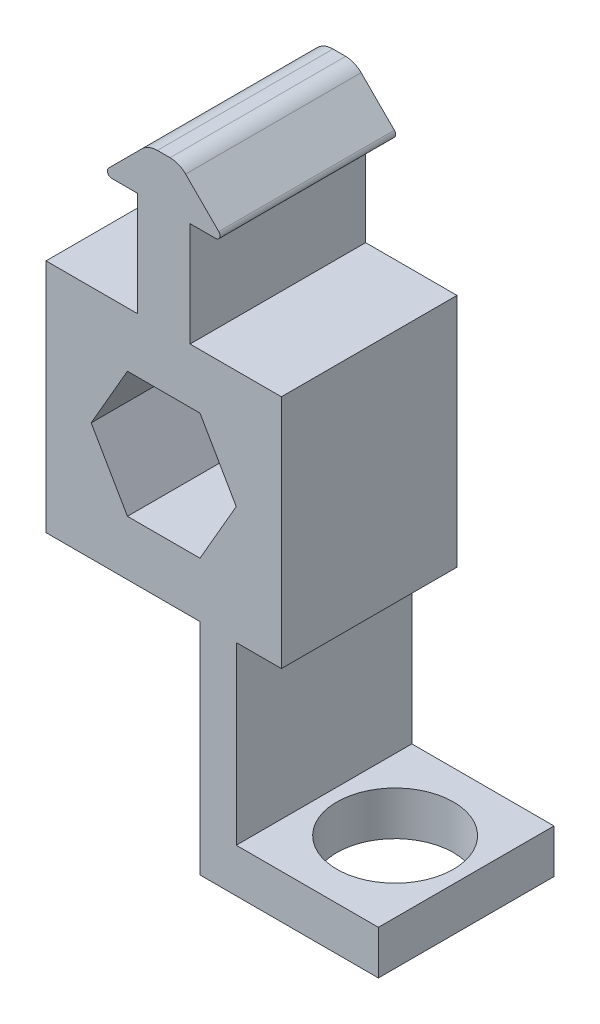
ISO-10303-21;
HEADER;
FILE_DESCRIPTION(('STEP AP214'),'2;1');
FILE_NAME('part.step','',(''),(''),'','','');
FILE_SCHEMA(('AUTOMOTIVE_DESIGN { 1 0 10303 214 1 1 1 1 }'));
ENDSEC;
DATA;
#1=APPLICATION_CONTEXT('core data for automotive mechanical design processes');
#2=APPLICATION_PROTOCOL_DEFINITION('international standard','automotive_design',2000,#1);
#3=PRODUCT_CONTEXT('',#1,'mechanical');
#4=PRODUCT('Part','Part','',(#3));
#5=PRODUCT_RELATED_PRODUCT_CATEGORY('part','',(#4));
#6=PRODUCT_DEFINITION_FORMATION('','',#4);
#7=PRODUCT_DEFINITION_CONTEXT('part definition',#1,'design');
#8=PRODUCT_DEFINITION('design','',#6,#7);
#9=PRODUCT_DEFINITION_SHAPE('','',#8);
#10=(LENGTH_UNIT() NAMED_UNIT(*) SI_UNIT(.MILLI.,.METRE.));
#11=(NAMED_UNIT(*) PLANE_ANGLE_UNIT() SI_UNIT($,.RADIAN.));
#12=(NAMED_UNIT(*) SI_UNIT($,.STERADIAN.) SOLID_ANGLE_UNIT());
#13=UNCERTAINTY_MEASURE_WITH_UNIT(LENGTH_MEASURE(1.E-05),#10,'distance_accuracy_value','');
#14=(GEOMETRIC_REPRESENTATION_CONTEXT(3) GLOBAL_UNCERTAINTY_ASSIGNED_CONTEXT((#13)) GLOBAL_UNIT_ASSIGNED_CONTEXT((#10,
#11,#12)) REPRESENTATION_CONTEXT('',''));
#15=CARTESIAN_POINT('',(0.,0.,0.));
#16=DIRECTION('',(0.,0.,1.));
#17=DIRECTION('',(1.,0.,0.));
#18=AXIS2_PLACEMENT_3D('',#15,#16,#17);
#19=CARTESIAN_POINT('',(-13.62075,-13.62075,10.16));
#20=DIRECTION('',(0.,1.,0.));
#21=DIRECTION('',(0.,0.,1.));
#22=AXIS2_PLACEMENT_3D('',#19,#20,#21);
#23=PLANE('',#22);
#24=DIRECTION('',(0.,0.,1.));
#25=VECTOR('',#24,1.);
#26=CARTESIAN_POINT('',(8.39553893942094,-13.62075,10.16));
#27=LINE('',#26,#25);
#28=CARTESIAN_POINT('',(8.39553893942094,-13.62075,-10.16));
#29=VERTEX_POINT('',#28);
#30=CARTESIAN_POINT('',(8.39553893942094,-13.62075,10.16));
#31=VERTEX_POINT('',#30);
#32=EDGE_CURVE('E272',#29,#31,#27,.T.);
#33=ORIENTED_EDGE('',*,*,#32,.F.);
#34=DIRECTION('',(1.,0.,0.));
#35=VECTOR('',#34,1.);
#36=CARTESIAN_POINT('',(-13.62075,-13.62075,-10.16));
#37=LINE('',#36,#35);
#38=CARTESIAN_POINT('',(13.62075,-13.62075,-10.16));
#39=VERTEX_POINT('',#38);
#40=EDGE_CURVE('E417',#29,#39,#37,.T.);
#41=ORIENTED_EDGE('',*,*,#40,.T.);
#42=DIRECTION('',(0.,0.,-1.));
#43=VECTOR('',#42,1.);
#44=CARTESIAN_POINT('',(13.62075,-13.62075,10.16));
#45=LINE('',#44,#43);
#46=CARTESIAN_POINT('',(13.62075,-13.62075,10.16));
#47=VERTEX_POINT('',#46);
#48=EDGE_CURVE('E510',#47,#39,#45,.T.);
#49=ORIENTED_EDGE('',*,*,#48,.F.);
#50=DIRECTION('',(1.,0.,0.));
#51=VECTOR('',#50,1.);
#52=CARTESIAN_POINT('',(-13.62075,-13.62075,10.16));
#53=LINE('',#52,#51);
#54=EDGE_CURVE('E367',#31,#47,#53,.T.);
#55=ORIENTED_EDGE('',*,*,#54,.F.);
#56=EDGE_LOOP('',(#33,#41,#49,#55));
#57=FACE_BOUND('',#56,.T.);
#58=ADVANCED_FACE('F39',(#57),#23,.F.);
#59=DIRECTION('',(0.,0.,-1.));
#60=VECTOR('',#59,1.);
#61=CARTESIAN_POINT('',(4.19776946971047,-13.62075,10.16));
#62=LINE('',#61,#60);
#63=CARTESIAN_POINT('',(4.19776946971047,-13.62075,10.16));
#64=VERTEX_POINT('',#63);
#65=CARTESIAN_POINT('',(4.19776946971047,-13.62075,-10.16));
#66=VERTEX_POINT('',#65);
#67=EDGE_CURVE('E63',#64,#66,#62,.T.);
#68=ORIENTED_EDGE('',*,*,#67,.F.);
#69=CARTESIAN_POINT('',(-13.62075,-13.62075,10.16));
#70=VERTEX_POINT('',#69);
#71=EDGE_CURVE('E368',#70,#64,#53,.T.);
#72=ORIENTED_EDGE('',*,*,#71,.F.);
#73=DIRECTION('',(0.,0.,-1.));
#74=VECTOR('',#73,1.);
#75=CARTESIAN_POINT('',(-13.62075,-13.62075,10.16));
#76=LINE('',#75,#74);
#77=CARTESIAN_POINT('',(-13.62075,-13.62075,-10.16));
#78=VERTEX_POINT('',#77);
#79=EDGE_CURVE('E48',#70,#78,#76,.T.);
#80=ORIENTED_EDGE('',*,*,#79,.T.);
#81=EDGE_CURVE('E418',#78,#66,#37,.T.);
#82=ORIENTED_EDGE('',*,*,#81,.T.);
#83=EDGE_LOOP('',(#68,#72,#80,#82));
#84=FACE_BOUND('',#83,.T.);
#85=ADVANCED_FACE('F517',(#84),#23,.F.);
#86=CARTESIAN_POINT('',(-6.01257951031447,26.19375,10.16));
#87=DIRECTION('',(0.,0.,-1.));
#88=DIRECTION('',(-1.,0.,0.));
#89=AXIS2_PLACEMENT_3D('',#86,#87,#88);
#90=PLANE('',#89);
#91=DIRECTION('',(-1.,0.,0.));
#92=VECTOR('',#91,1.);
#93=CARTESIAN_POINT('',(-13.62075,13.62075,10.16));
#94=LINE('',#93,#92);
#95=CARTESIAN_POINT('',(-3.048,13.62075,10.16));
#96=VERTEX_POINT('',#95);
#97=CARTESIAN_POINT('',(-13.62075,13.62075,10.16));
#98=VERTEX_POINT('',#97);
#99=EDGE_CURVE('E360',#96,#98,#94,.T.);
#100=ORIENTED_EDGE('',*,*,#99,.T.);
#101=DIRECTION('',(0.,-1.,0.));
#102=VECTOR('',#101,1.);
#103=CARTESIAN_POINT('',(-13.62075,13.62075,10.16));
#104=LINE('',#103,#102);
#105=EDGE_CURVE('E363',#98,#70,#104,.T.);
#106=ORIENTED_EDGE('',*,*,#105,.T.);
#107=ORIENTED_EDGE('',*,*,#71,.T.);
#108=DIRECTION('',(0.,1.,0.));
#109=VECTOR('',#108,1.);
#110=CARTESIAN_POINT('',(4.19776946971047,-39.02075,10.16));
#111=LINE('',#110,#109);
#112=CARTESIAN_POINT('',(4.19776946971047,-39.02075,10.16));
#113=VERTEX_POINT('',#112);
#114=EDGE_CURVE('E292',#113,#64,#111,.T.);
#115=ORIENTED_EDGE('',*,*,#114,.F.);
#116=DIRECTION('',(-1.,0.,0.));
#117=VECTOR('',#116,1.);
#118=CARTESIAN_POINT('',(4.19776946971047,-39.02075,10.16));
#119=LINE('',#118,#117);
#120=CARTESIAN_POINT('',(24.8459610605791,-39.02075,10.16));
#121=VERTEX_POINT('',#120);
#122=EDGE_CURVE('E233',#121,#113,#119,.T.);
#123=ORIENTED_EDGE('',*,*,#122,.F.);
#124=DIRECTION('',(0.,-1.,0.));
#125=VECTOR('',#124,1.);
#126=CARTESIAN_POINT('',(24.8459610605791,-33.94075,10.16));
#127=LINE('',#126,#125);
#128=CARTESIAN_POINT('',(24.8459610605791,-33.94075,10.16));
#129=VERTEX_POINT('',#128);
#130=EDGE_CURVE('E225',#129,#121,#127,.T.);
#131=ORIENTED_EDGE('',*,*,#130,.F.);
#132=DIRECTION('',(-1.,0.,0.));
#133=VECTOR('',#132,1.);
#134=CARTESIAN_POINT('',(8.39553893942094,-33.94075,10.16));
#135=LINE('',#134,#133);
#136=CARTESIAN_POINT('',(8.39553893942094,-33.94075,10.16));
#137=VERTEX_POINT('',#136);
#138=EDGE_CURVE('E230',#129,#137,#135,.T.);
#139=ORIENTED_EDGE('',*,*,#138,.T.);
#140=DIRECTION('',(0.,1.,0.));
#141=VECTOR('',#140,1.);
#142=CARTESIAN_POINT('',(8.39553893942094,-39.02075,10.16));
#143=LINE('',#142,#141);
#144=EDGE_CURVE('E55',#137,#31,#143,.T.);
#145=ORIENTED_EDGE('',*,*,#144,.T.);
#146=ORIENTED_EDGE('',*,*,#54,.T.);
#147=DIRECTION('',(0.,1.,0.));
#148=VECTOR('',#147,1.);
#149=CARTESIAN_POINT('',(13.62075,-13.62075,10.16));
#150=LINE('',#149,#148);
#151=CARTESIAN_POINT('',(13.62075,13.62075,10.16));
#152=VERTEX_POINT('',#151);
#153=EDGE_CURVE('E371',#47,#152,#150,.T.);
#154=ORIENTED_EDGE('',*,*,#153,.T.);
#155=DIRECTION('',(-1.,0.,0.));
#156=VECTOR('',#155,1.);
#157=CARTESIAN_POINT('',(13.62075,13.62075,10.16));
#158=LINE('',#157,#156);
#159=CARTESIAN_POINT('',(3.048,13.62075,10.16));
#160=VERTEX_POINT('',#159);
#161=EDGE_CURVE('E374',#152,#160,#158,.T.);
#162=ORIENTED_EDGE('',*,*,#161,.T.);
#163=DIRECTION('',(0.,1.,0.));
#164=VECTOR('',#163,1.);
#165=CARTESIAN_POINT('',(3.048,13.62075,10.16));
#166=LINE('',#165,#164);
#167=CARTESIAN_POINT('',(3.048,25.68575,10.16));
#168=VERTEX_POINT('',#167);
#169=EDGE_CURVE('E377',#160,#168,#166,.T.);
#170=ORIENTED_EDGE('',*,*,#169,.T.);
#171=DIRECTION('',(1.,0.,0.));
#172=VECTOR('',#171,1.);
#173=CARTESIAN_POINT('',(3.048,25.68575,10.16));
#174=LINE('',#173,#172);
#175=CARTESIAN_POINT('',(6.01257951031446,25.68575,10.16));
#176=VERTEX_POINT('',#175);
#177=EDGE_CURVE('E380',#168,#176,#174,.T.);
#178=ORIENTED_EDGE('',*,*,#177,.T.);
#179=CARTESIAN_POINT('',(6.01257951031447,26.19375,10.16));
#180=DIRECTION('',(0.,0.,1.));
#181=DIRECTION('',(1.,0.,0.));
#182=AXIS2_PLACEMENT_3D('',#179,#180,#181);
#183=CIRCLE('',#182,0.508000000000002);
#184=CARTESIAN_POINT('',(6.37178975515724,26.5529602448428,10.16));
#185=VERTEX_POINT('',#184);
#186=EDGE_CURVE('E383',#176,#185,#183,.T.);
#187=ORIENTED_EDGE('',*,*,#186,.T.);
#188=DIRECTION('',(-0.707106781186546,0.707106781186549,0.));
#189=VECTOR('',#188,1.);
#190=CARTESIAN_POINT('',(6.37178975515723,26.5529602448428,10.16));
#191=LINE('',#190,#189);
#192=CARTESIAN_POINT('',(2.53210877578618,30.3926412242138,10.16));
#193=VERTEX_POINT('',#192);
#194=EDGE_CURVE('E386',#185,#193,#191,.T.);
#195=ORIENTED_EDGE('',*,*,#194,.T.);
#196=CARTESIAN_POINT('',(0.736057551572354,28.59659,10.16));
#197=DIRECTION('',(0.,0.,1.));
#198=DIRECTION('',(1.,0.,0.));
#199=AXIS2_PLACEMENT_3D('',#196,#197,#198);
#200=CIRCLE('',#199,2.54);
#201=CARTESIAN_POINT('',(0.736057551572349,31.13659,10.16));
#202=VERTEX_POINT('',#201);
#203=EDGE_CURVE('E389',#193,#202,#200,.T.);
#204=ORIENTED_EDGE('',*,*,#203,.T.);
#205=DIRECTION('',(-1.,0.,0.));
#206=VECTOR('',#205,1.);
#207=CARTESIAN_POINT('',(-0.736057551572349,31.13659,10.16));
#208=LINE('',#207,#206);
#209=CARTESIAN_POINT('',(-0.736057551572349,31.13659,10.16));
#210=VERTEX_POINT('',#209);
#211=EDGE_CURVE('E392',#202,#210,#208,.T.);
#212=ORIENTED_EDGE('',*,*,#211,.T.);
#213=CARTESIAN_POINT('',(-0.736057551572354,28.59659,10.16));
#214=DIRECTION('',(0.,0.,1.));
#215=DIRECTION('',(-1.,0.,0.));
#216=AXIS2_PLACEMENT_3D('',#213,#214,#215);
#217=CIRCLE('',#216,2.54);
#218=CARTESIAN_POINT('',(-2.53210877578619,30.3926412242138,10.16));
#219=VERTEX_POINT('',#218);
#220=EDGE_CURVE('E395',#210,#219,#217,.T.);
#221=ORIENTED_EDGE('',*,*,#220,.T.);
#222=DIRECTION('',(-0.707106781186546,-0.707106781186549,0.));
#223=VECTOR('',#222,1.);
#224=CARTESIAN_POINT('',(-6.37178975515723,26.5529602448428,10.16));
#225=LINE('',#224,#223);
#226=CARTESIAN_POINT('',(-6.37178975515723,26.5529602448428,10.16));
#227=VERTEX_POINT('',#226);
#228=EDGE_CURVE('E398',#219,#227,#225,.T.);
#229=ORIENTED_EDGE('',*,*,#228,.T.);
#230=CARTESIAN_POINT('',(-6.01257951031447,26.19375,10.16));
#231=DIRECTION('',(0.,0.,1.));
#232=DIRECTION('',(-1.,0.,0.));
#233=AXIS2_PLACEMENT_3D('',#230,#231,#232);
#234=CIRCLE('',#233,0.508000000000002);
#235=CARTESIAN_POINT('',(-6.01257951031446,25.68575,10.16));
#236=VERTEX_POINT('',#235);
#237=EDGE_CURVE('E401',#227,#236,#234,.T.);
#238=ORIENTED_EDGE('',*,*,#237,.T.);
#239=DIRECTION('',(1.,0.,0.));
#240=VECTOR('',#239,1.);
#241=CARTESIAN_POINT('',(-3.048,25.68575,10.16));
#242=LINE('',#241,#240);
#243=CARTESIAN_POINT('',(-3.048,25.68575,10.16));
#244=VERTEX_POINT('',#243);
#245=EDGE_CURVE('E404',#236,#244,#242,.T.);
#246=ORIENTED_EDGE('',*,*,#245,.T.);
#247=DIRECTION('',(0.,-1.,0.));
#248=VECTOR('',#247,1.);
#249=CARTESIAN_POINT('',(-3.048,13.62075,10.16));
#250=LINE('',#249,#248);
#251=EDGE_CURVE('E407',#244,#96,#250,.T.);
#252=ORIENTED_EDGE('',*,*,#251,.T.);
#253=EDGE_LOOP('',(#100,#106,#107,#115,#123,#131,#139,#145,#146,#154,#162,#170,#178,#187,#195,
#204,#212,#221,#229,#238,#246,#252));
#254=FACE_BOUND('',#253,.T.);
#255=DIRECTION('',(-1.,0.,0.));
#256=VECTOR('',#255,1.);
#257=CARTESIAN_POINT('',(4.19776946971047,7.27075,10.16));
#258=LINE('',#257,#256);
#259=CARTESIAN_POINT('',(4.19776946971047,7.27075,10.16));
#260=VERTEX_POINT('',#259);
#261=CARTESIAN_POINT('',(-4.19776946971047,7.27075,10.16));
#262=VERTEX_POINT('',#261);
#263=EDGE_CURVE('E297',#260,#262,#258,.T.);
#264=ORIENTED_EDGE('',*,*,#263,.F.);
#265=DIRECTION('',(-0.5,0.866025403784438,0.));
#266=VECTOR('',#265,1.);
#267=CARTESIAN_POINT('',(8.39553893942094,0.,10.16));
#268=LINE('',#267,#266);
#269=CARTESIAN_POINT('',(8.39553893942094,0.,10.16));
#270=VERTEX_POINT('',#269);
#271=EDGE_CURVE('E314',#270,#260,#268,.T.);
#272=ORIENTED_EDGE('',*,*,#271,.F.);
#273=DIRECTION('',(0.5,0.866025403784439,0.));
#274=VECTOR('',#273,1.);
#275=CARTESIAN_POINT('',(4.19776946971048,-7.27075,10.16));
#276=LINE('',#275,#274);
#277=CARTESIAN_POINT('',(4.19776946971048,-7.27075,10.16));
#278=VERTEX_POINT('',#277);
#279=EDGE_CURVE('E310',#278,#270,#276,.T.);
#280=ORIENTED_EDGE('',*,*,#279,.F.);
#281=DIRECTION('',(1.,0.,0.));
#282=VECTOR('',#281,1.);
#283=CARTESIAN_POINT('',(-4.19776946971047,-7.27075,10.16));
#284=LINE('',#283,#282);
#285=CARTESIAN_POINT('',(-4.19776946971047,-7.27075,10.16));
#286=VERTEX_POINT('',#285);
#287=EDGE_CURVE('E307',#286,#278,#284,.T.);
#288=ORIENTED_EDGE('',*,*,#287,.F.);
#289=DIRECTION('',(0.5,-0.866025403784438,0.));
#290=VECTOR('',#289,1.);
#291=CARTESIAN_POINT('',(-8.39553893942094,0.,10.16));
#292=LINE('',#291,#290);
#293=CARTESIAN_POINT('',(-8.39553893942094,0.,10.16));
#294=VERTEX_POINT('',#293);
#295=EDGE_CURVE('E304',#294,#286,#292,.T.);
#296=ORIENTED_EDGE('',*,*,#295,.F.);
#297=DIRECTION('',(-0.5,-0.866025403784439,0.));
#298=VECTOR('',#297,1.);
#299=CARTESIAN_POINT('',(-4.19776946971047,7.27075,10.16));
#300=LINE('',#299,#298);
#301=EDGE_CURVE('E300',#262,#294,#300,.T.);
#302=ORIENTED_EDGE('',*,*,#301,.F.);
#303=EDGE_LOOP('',(#264,#272,#280,#288,#296,#302));
#304=FACE_BOUND('',#303,.T.);
#305=ADVANCED_FACE('F228',(#254,#304),#90,.F.);
#306=CARTESIAN_POINT('',(-6.01257951031447,26.19375,-10.16));
#307=DIRECTION('',(0.,0.,-1.));
#308=DIRECTION('',(-1.,0.,0.));
#309=AXIS2_PLACEMENT_3D('',#306,#307,#308);
#310=PLANE('',#309);
#311=DIRECTION('',(-1.,0.,0.));
#312=VECTOR('',#311,1.);
#313=CARTESIAN_POINT('',(-13.62075,13.62075,-10.16));
#314=LINE('',#313,#312);
#315=CARTESIAN_POINT('',(-3.048,13.62075,-10.16));
#316=VERTEX_POINT('',#315);
#317=CARTESIAN_POINT('',(-13.62075,13.62075,-10.16));
#318=VERTEX_POINT('',#317);
#319=EDGE_CURVE('E359',#316,#318,#314,.T.);
#320=ORIENTED_EDGE('',*,*,#319,.F.);
#321=DIRECTION('',(0.,-1.,0.));
#322=VECTOR('',#321,1.);
#323=CARTESIAN_POINT('',(-3.048,13.62075,-10.16));
#324=LINE('',#323,#322);
#325=CARTESIAN_POINT('',(-3.048,25.68575,-10.16));
#326=VERTEX_POINT('',#325);
#327=EDGE_CURVE('E364',#326,#316,#324,.T.);
#328=ORIENTED_EDGE('',*,*,#327,.F.);
#329=DIRECTION('',(1.,0.,0.));
#330=VECTOR('',#329,1.);
#331=CARTESIAN_POINT('',(-3.048,25.68575,-10.16));
#332=LINE('',#331,#330);
#333=CARTESIAN_POINT('',(-6.01257951031446,25.68575,-10.16));
#334=VERTEX_POINT('',#333);
#335=EDGE_CURVE('E454',#334,#326,#332,.T.);
#336=ORIENTED_EDGE('',*,*,#335,.F.);
#337=CARTESIAN_POINT('',(-6.01257951031447,26.19375,-10.16));
#338=DIRECTION('',(0.,0.,1.));
#339=DIRECTION('',(-1.,0.,0.));
#340=AXIS2_PLACEMENT_3D('',#337,#338,#339);
#341=CIRCLE('',#340,0.508000000000002);
#342=CARTESIAN_POINT('',(-6.37178975515723,26.5529602448428,-10.16));
#343=VERTEX_POINT('',#342);
#344=EDGE_CURVE('E451',#343,#334,#341,.T.);
#345=ORIENTED_EDGE('',*,*,#344,.F.);
#346=DIRECTION('',(-0.707106781186546,-0.707106781186549,0.));
#347=VECTOR('',#346,1.);
#348=CARTESIAN_POINT('',(-6.37178975515723,26.5529602448428,-10.16));
#349=LINE('',#348,#347);
#350=CARTESIAN_POINT('',(-2.53210877578619,30.3926412242138,-10.16));
#351=VERTEX_POINT('',#350);
#352=EDGE_CURVE('E448',#351,#343,#349,.T.);
#353=ORIENTED_EDGE('',*,*,#352,.F.);
#354=CARTESIAN_POINT('',(-0.736057551572354,28.59659,-10.16));
#355=DIRECTION('',(0.,0.,1.));
#356=DIRECTION('',(-1.,0.,0.));
#357=AXIS2_PLACEMENT_3D('',#354,#355,#356);
#358=CIRCLE('',#357,2.54);
#359=CARTESIAN_POINT('',(-0.736057551572349,31.13659,-10.16));
#360=VERTEX_POINT('',#359);
#361=EDGE_CURVE('E445',#360,#351,#358,.T.);
#362=ORIENTED_EDGE('',*,*,#361,.F.);
#363=DIRECTION('',(-1.,0.,0.));
#364=VECTOR('',#363,1.);
#365=CARTESIAN_POINT('',(-0.736057551572349,31.13659,-10.16));
#366=LINE('',#365,#364);
#367=CARTESIAN_POINT('',(0.736057551572349,31.13659,-10.16));
#368=VERTEX_POINT('',#367);
#369=EDGE_CURVE('E442',#368,#360,#366,.T.);
#370=ORIENTED_EDGE('',*,*,#369,.F.);
#371=CARTESIAN_POINT('',(0.736057551572354,28.59659,-10.16));
#372=DIRECTION('',(0.,0.,1.));
#373=DIRECTION('',(1.,0.,0.));
#374=AXIS2_PLACEMENT_3D('',#371,#372,#373);
#375=CIRCLE('',#374,2.54);
#376=CARTESIAN_POINT('',(2.53210877578618,30.3926412242138,-10.16));
#377=VERTEX_POINT('',#376);
#378=EDGE_CURVE('E439',#377,#368,#375,.T.);
#379=ORIENTED_EDGE('',*,*,#378,.F.);
#380=DIRECTION('',(-0.707106781186546,0.707106781186549,0.));
#381=VECTOR('',#380,1.);
#382=CARTESIAN_POINT('',(6.37178975515723,26.5529602448428,-10.16));
#383=LINE('',#382,#381);
#384=CARTESIAN_POINT('',(6.37178975515724,26.5529602448428,-10.16));
#385=VERTEX_POINT('',#384);
#386=EDGE_CURVE('E436',#385,#377,#383,.T.);
#387=ORIENTED_EDGE('',*,*,#386,.F.);
#388=CARTESIAN_POINT('',(6.01257951031447,26.19375,-10.16));
#389=DIRECTION('',(0.,0.,1.));
#390=DIRECTION('',(1.,0.,0.));
#391=AXIS2_PLACEMENT_3D('',#388,#389,#390);
#392=CIRCLE('',#391,0.508000000000002);
#393=CARTESIAN_POINT('',(6.01257951031446,25.68575,-10.16));
#394=VERTEX_POINT('',#393);
#395=EDGE_CURVE('E433',#394,#385,#392,.T.);
#396=ORIENTED_EDGE('',*,*,#395,.F.);
#397=DIRECTION('',(1.,0.,0.));
#398=VECTOR('',#397,1.);
#399=CARTESIAN_POINT('',(3.048,25.68575,-10.16));
#400=LINE('',#399,#398);
#401=CARTESIAN_POINT('',(3.048,25.68575,-10.16));
#402=VERTEX_POINT('',#401);
#403=EDGE_CURVE('E430',#402,#394,#400,.T.);
#404=ORIENTED_EDGE('',*,*,#403,.F.);
#405=DIRECTION('',(0.,1.,0.));
#406=VECTOR('',#405,1.);
#407=CARTESIAN_POINT('',(3.048,13.62075,-10.16));
#408=LINE('',#407,#406);
#409=CARTESIAN_POINT('',(3.048,13.62075,-10.16));
#410=VERTEX_POINT('',#409);
#411=EDGE_CURVE('E427',#410,#402,#408,.T.);
#412=ORIENTED_EDGE('',*,*,#411,.F.);
#413=DIRECTION('',(-1.,0.,0.));
#414=VECTOR('',#413,1.);
#415=CARTESIAN_POINT('',(13.62075,13.62075,-10.16));
#416=LINE('',#415,#414);
#417=CARTESIAN_POINT('',(13.62075,13.62075,-10.16));
#418=VERTEX_POINT('',#417);
#419=EDGE_CURVE('E424',#418,#410,#416,.T.);
#420=ORIENTED_EDGE('',*,*,#419,.F.);
#421=DIRECTION('',(0.,1.,0.));
#422=VECTOR('',#421,1.);
#423=CARTESIAN_POINT('',(13.62075,-13.62075,-10.16));
#424=LINE('',#423,#422);
#425=EDGE_CURVE('E421',#39,#418,#424,.T.);
#426=ORIENTED_EDGE('',*,*,#425,.F.);
#427=ORIENTED_EDGE('',*,*,#40,.F.);
#428=DIRECTION('',(0.,1.,0.));
#429=VECTOR('',#428,1.);
#430=CARTESIAN_POINT('',(8.39553893942094,-39.02075,-10.16));
#431=LINE('',#430,#429);
#432=CARTESIAN_POINT('',(8.39553893942094,-33.94075,-10.16));
#433=VERTEX_POINT('',#432);
#434=EDGE_CURVE('E285',#433,#29,#431,.T.);
#435=ORIENTED_EDGE('',*,*,#434,.F.);
#436=DIRECTION('',(1.,0.,0.));
#437=VECTOR('',#436,1.);
#438=CARTESIAN_POINT('',(24.8459610605791,-33.94075,-10.16));
#439=LINE('',#438,#437);
#440=CARTESIAN_POINT('',(24.8459610605791,-33.94075,-10.16));
#441=VERTEX_POINT('',#440);
#442=EDGE_CURVE('E240',#433,#441,#439,.T.);
#443=ORIENTED_EDGE('',*,*,#442,.T.);
#444=DIRECTION('',(0.,-1.,0.));
#445=VECTOR('',#444,1.);
#446=CARTESIAN_POINT('',(24.8459610605791,-33.94075,-10.16));
#447=LINE('',#446,#445);
#448=CARTESIAN_POINT('',(24.8459610605791,-39.02075,-10.16));
#449=VERTEX_POINT('',#448);
#450=EDGE_CURVE('E239',#441,#449,#447,.T.);
#451=ORIENTED_EDGE('',*,*,#450,.T.);
#452=DIRECTION('',(1.,0.,0.));
#453=VECTOR('',#452,1.);
#454=CARTESIAN_POINT('',(4.19776946971047,-39.02075,-10.16));
#455=LINE('',#454,#453);
#456=CARTESIAN_POINT('',(4.19776946971047,-39.02075,-10.16));
#457=VERTEX_POINT('',#456);
#458=EDGE_CURVE('E275',#457,#449,#455,.T.);
#459=ORIENTED_EDGE('',*,*,#458,.F.);
#460=DIRECTION('',(0.,1.,0.));
#461=VECTOR('',#460,1.);
#462=CARTESIAN_POINT('',(4.19776946971047,-39.02075,-10.16));
#463=LINE('',#462,#461);
#464=EDGE_CURVE('E288',#457,#66,#463,.T.);
#465=ORIENTED_EDGE('',*,*,#464,.T.);
#466=ORIENTED_EDGE('',*,*,#81,.F.);
#467=DIRECTION('',(0.,-1.,0.));
#468=VECTOR('',#467,1.);
#469=CARTESIAN_POINT('',(-13.62075,13.62075,-10.16));
#470=LINE('',#469,#468);
#471=EDGE_CURVE('E414',#318,#78,#470,.T.);
#472=ORIENTED_EDGE('',*,*,#471,.F.);
#473=EDGE_LOOP('',(#320,#328,#336,#345,#353,#362,#370,#379,#387,#396,#404,#412,#420,#426,#427,
#435,#443,#451,#459,#465,#466,#472));
#474=FACE_BOUND('',#473,.T.);
#475=DIRECTION('',(-0.5,0.866025403784438,0.));
#476=VECTOR('',#475,1.);
#477=CARTESIAN_POINT('',(8.39553893942094,0.,-10.16));
#478=LINE('',#477,#476);
#479=CARTESIAN_POINT('',(8.39553893942094,0.,-10.16));
#480=VERTEX_POINT('',#479);
#481=CARTESIAN_POINT('',(4.19776946971047,7.27075,-10.16));
#482=VERTEX_POINT('',#481);
#483=EDGE_CURVE('E301',#480,#482,#478,.T.);
#484=ORIENTED_EDGE('',*,*,#483,.T.);
#485=DIRECTION('',(-1.,0.,0.));
#486=VECTOR('',#485,1.);
#487=CARTESIAN_POINT('',(4.19776946971047,7.27075,-10.16));
#488=LINE('',#487,#486);
#489=CARTESIAN_POINT('',(-4.19776946971047,7.27075,-10.16));
#490=VERTEX_POINT('',#489);
#491=EDGE_CURVE('E296',#482,#490,#488,.T.);
#492=ORIENTED_EDGE('',*,*,#491,.T.);
#493=DIRECTION('',(-0.5,-0.866025403784439,0.));
#494=VECTOR('',#493,1.);
#495=CARTESIAN_POINT('',(-4.19776946971047,7.27075,-10.16));
#496=LINE('',#495,#494);
#497=CARTESIAN_POINT('',(-8.39553893942094,0.,-10.16));
#498=VERTEX_POINT('',#497);
#499=EDGE_CURVE('E321',#490,#498,#496,.T.);
#500=ORIENTED_EDGE('',*,*,#499,.T.);
#501=DIRECTION('',(0.5,-0.866025403784438,0.));
#502=VECTOR('',#501,1.);
#503=CARTESIAN_POINT('',(-8.39553893942094,0.,-10.16));
#504=LINE('',#503,#502);
#505=CARTESIAN_POINT('',(-4.19776946971047,-7.27075,-10.16));
#506=VERTEX_POINT('',#505);
#507=EDGE_CURVE('E325',#498,#506,#504,.T.);
#508=ORIENTED_EDGE('',*,*,#507,.T.);
#509=DIRECTION('',(1.,0.,0.));
#510=VECTOR('',#509,1.);
#511=CARTESIAN_POINT('',(-4.19776946971047,-7.27075,-10.16));
#512=LINE('',#511,#510);
#513=CARTESIAN_POINT('',(4.19776946971048,-7.27075,-10.16));
#514=VERTEX_POINT('',#513);
#515=EDGE_CURVE('E329',#506,#514,#512,.T.);
#516=ORIENTED_EDGE('',*,*,#515,.T.);
#517=DIRECTION('',(0.5,0.866025403784439,0.));
#518=VECTOR('',#517,1.);
#519=CARTESIAN_POINT('',(4.19776946971048,-7.27075,-10.16));
#520=LINE('',#519,#518);
#521=EDGE_CURVE('E333',#514,#480,#520,.T.);
#522=ORIENTED_EDGE('',*,*,#521,.T.);
#523=EDGE_LOOP('',(#484,#492,#500,#508,#516,#522));
#524=FACE_BOUND('',#523,.T.);
#525=ADVANCED_FACE('F521',(#474,#524),#310,.T.);
#526=CARTESIAN_POINT('',(-13.62075,13.62075,10.16));
#527=DIRECTION('',(0.,-1.,0.));
#528=DIRECTION('',(0.,0.,-1.));
#529=AXIS2_PLACEMENT_3D('',#526,#527,#528);
#530=PLANE('',#529);
#531=ORIENTED_EDGE('',*,*,#319,.T.);
#532=DIRECTION('',(0.,0.,-1.));
#533=VECTOR('',#532,1.);
#534=CARTESIAN_POINT('',(-13.62075,13.62075,10.16));
#535=LINE('',#534,#533);
#536=EDGE_CURVE('E11',#98,#318,#535,.T.);
#537=ORIENTED_EDGE('',*,*,#536,.F.);
#538=ORIENTED_EDGE('',*,*,#99,.F.);
#539=DIRECTION('',(0.,0.,-1.));
#540=VECTOR('',#539,1.);
#541=CARTESIAN_POINT('',(-3.048,13.62075,10.16));
#542=LINE('',#541,#540);
#543=EDGE_CURVE('E410',#96,#316,#542,.T.);
#544=ORIENTED_EDGE('',*,*,#543,.T.);
#545=EDGE_LOOP('',(#531,#537,#538,#544));
#546=FACE_BOUND('',#545,.T.);
#547=ADVANCED_FACE('F41',(#546),#530,.F.);
#548=CARTESIAN_POINT('',(-13.62075,13.62075,10.16));
#549=DIRECTION('',(1.,0.,0.));
#550=DIRECTION('',(0.,0.,-1.));
#551=AXIS2_PLACEMENT_3D('',#548,#549,#550);
#552=PLANE('',#551);
#553=ORIENTED_EDGE('',*,*,#471,.T.);
#554=ORIENTED_EDGE('',*,*,#79,.F.);
#555=ORIENTED_EDGE('',*,*,#105,.F.);
#556=ORIENTED_EDGE('',*,*,#536,.T.);
#557=EDGE_LOOP('',(#553,#554,#555,#556));
#558=FACE_BOUND('',#557,.T.);
#559=ADVANCED_FACE('F529',(#558),#552,.F.);
#560=CARTESIAN_POINT('',(13.62075,-13.62075,10.16));
#561=DIRECTION('',(-1.,0.,0.));
#562=DIRECTION('',(0.,-1.,0.));
#563=AXIS2_PLACEMENT_3D('',#560,#561,#562);
#564=PLANE('',#563);
#565=ORIENTED_EDGE('',*,*,#425,.T.);
#566=DIRECTION('',(0.,0.,-1.));
#567=VECTOR('',#566,1.);
#568=CARTESIAN_POINT('',(13.62075,13.62075,10.16));
#569=LINE('',#568,#567);
#570=EDGE_CURVE('E506',#152,#418,#569,.T.);
#571=ORIENTED_EDGE('',*,*,#570,.F.);
#572=ORIENTED_EDGE('',*,*,#153,.F.);
#573=ORIENTED_EDGE('',*,*,#48,.T.);
#574=EDGE_LOOP('',(#565,#571,#572,#573));
#575=FACE_BOUND('',#574,.T.);
#576=ADVANCED_FACE('F596',(#575),#564,.F.);
#577=CARTESIAN_POINT('',(13.62075,13.62075,10.16));
#578=DIRECTION('',(0.,-1.,0.));
#579=DIRECTION('',(1.,0.,0.));
#580=AXIS2_PLACEMENT_3D('',#577,#578,#579);
#581=PLANE('',#580);
#582=ORIENTED_EDGE('',*,*,#419,.T.);
#583=DIRECTION('',(0.,0.,-1.));
#584=VECTOR('',#583,1.);
#585=CARTESIAN_POINT('',(3.048,13.62075,10.16));
#586=LINE('',#585,#584);
#587=EDGE_CURVE('E502',#160,#410,#586,.T.);
#588=ORIENTED_EDGE('',*,*,#587,.F.);
#589=ORIENTED_EDGE('',*,*,#161,.F.);
#590=ORIENTED_EDGE('',*,*,#570,.T.);
#591=EDGE_LOOP('',(#582,#588,#589,#590));
#592=FACE_BOUND('',#591,.T.);
#593=ADVANCED_FACE('F590',(#592),#581,.F.);
#594=CARTESIAN_POINT('',(3.048,13.62075,10.16));
#595=DIRECTION('',(-1.,0.,0.));
#596=DIRECTION('',(0.,-1.,0.));
#597=AXIS2_PLACEMENT_3D('',#594,#595,#596);
#598=PLANE('',#597);
#599=ORIENTED_EDGE('',*,*,#411,.T.);
#600=DIRECTION('',(0.,0.,-1.));
#601=VECTOR('',#600,1.);
#602=CARTESIAN_POINT('',(3.048,25.68575,10.16));
#603=LINE('',#602,#601);
#604=EDGE_CURVE('E498',#168,#402,#603,.T.);
#605=ORIENTED_EDGE('',*,*,#604,.F.);
#606=ORIENTED_EDGE('',*,*,#169,.F.);
#607=ORIENTED_EDGE('',*,*,#587,.T.);
#608=EDGE_LOOP('',(#599,#605,#606,#607));
#609=FACE_BOUND('',#608,.T.);
#610=ADVANCED_FACE('F586',(#609),#598,.F.);
#611=CARTESIAN_POINT('',(3.048,25.68575,10.16));
#612=DIRECTION('',(0.,1.,0.));
#613=DIRECTION('',(-1.,0.,0.));
#614=AXIS2_PLACEMENT_3D('',#611,#612,#613);
#615=PLANE('',#614);
#616=ORIENTED_EDGE('',*,*,#403,.T.);
#617=DIRECTION('',(0.,0.,-1.));
#618=VECTOR('',#617,1.);
#619=CARTESIAN_POINT('',(6.01257951031446,25.68575,10.16));
#620=LINE('',#619,#618);
#621=EDGE_CURVE('E494',#176,#394,#620,.T.);
#622=ORIENTED_EDGE('',*,*,#621,.F.);
#623=ORIENTED_EDGE('',*,*,#177,.F.);
#624=ORIENTED_EDGE('',*,*,#604,.T.);
#625=EDGE_LOOP('',(#616,#622,#623,#624));
#626=FACE_BOUND('',#625,.T.);
#627=ADVANCED_FACE('F581',(#626),#615,.F.);
#628=CARTESIAN_POINT('',(6.01257951031447,26.19375,10.16));
#629=DIRECTION('',(0.,0.,-1.));
#630=DIRECTION('',(-1.,0.,0.));
#631=AXIS2_PLACEMENT_3D('',#628,#629,#630);
#632=CYLINDRICAL_SURFACE('',#631,0.508000000000002);
#633=ORIENTED_EDGE('',*,*,#395,.T.);
#634=DIRECTION('',(0.,0.,-1.));
#635=VECTOR('',#634,1.);
#636=CARTESIAN_POINT('',(6.37178975515724,26.5529602448428,10.16));
#637=LINE('',#636,#635);
#638=EDGE_CURVE('E490',#185,#385,#637,.T.);
#639=ORIENTED_EDGE('',*,*,#638,.F.);
#640=ORIENTED_EDGE('',*,*,#186,.F.);
#641=ORIENTED_EDGE('',*,*,#621,.T.);
#642=EDGE_LOOP('',(#633,#639,#640,#641));
#643=FACE_BOUND('',#642,.T.);
#644=ADVANCED_FACE('F575',(#643),#632,.T.);
#645=CARTESIAN_POINT('',(6.37178975515723,26.5529602448428,10.16));
#646=DIRECTION('',(-0.707106781186549,-0.707106781186546,0.));
#647=DIRECTION('',(0.707106781186546,-0.707106781186549,0.));
#648=AXIS2_PLACEMENT_3D('',#645,#646,#647);
#649=PLANE('',#648);
#650=ORIENTED_EDGE('',*,*,#386,.T.);
#651=DIRECTION('',(0.,0.,-1.));
#652=VECTOR('',#651,1.);
#653=CARTESIAN_POINT('',(2.53210877578618,30.3926412242138,10.16));
#654=LINE('',#653,#652);
#655=EDGE_CURVE('E486',#193,#377,#654,.T.);
#656=ORIENTED_EDGE('',*,*,#655,.F.);
#657=ORIENTED_EDGE('',*,*,#194,.F.);
#658=ORIENTED_EDGE('',*,*,#638,.T.);
#659=EDGE_LOOP('',(#650,#656,#657,#658));
#660=FACE_BOUND('',#659,.T.);
#661=ADVANCED_FACE('F571',(#660),#649,.F.);
#662=CARTESIAN_POINT('',(0.736057551572354,28.59659,10.16));
#663=DIRECTION('',(0.,0.,-1.));
#664=DIRECTION('',(-1.,0.,0.));
#665=AXIS2_PLACEMENT_3D('',#662,#663,#664);
#666=CYLINDRICAL_SURFACE('',#665,2.54);
#667=ORIENTED_EDGE('',*,*,#378,.T.);
#668=DIRECTION('',(0.,0.,-1.));
#669=VECTOR('',#668,1.);
#670=CARTESIAN_POINT('',(0.736057551572349,31.13659,10.16));
#671=LINE('',#670,#669);
#672=EDGE_CURVE('E482',#202,#368,#671,.T.);
#673=ORIENTED_EDGE('',*,*,#672,.F.);
#674=ORIENTED_EDGE('',*,*,#203,.F.);
#675=ORIENTED_EDGE('',*,*,#655,.T.);
#676=EDGE_LOOP('',(#667,#673,#674,#675));
#677=FACE_BOUND('',#676,.T.);
#678=ADVANCED_FACE('F566',(#677),#666,.T.);
#679=CARTESIAN_POINT('',(-0.736057551572349,31.13659,10.16));
#680=DIRECTION('',(0.,-1.,0.));
#681=DIRECTION('',(0.,0.,-1.));
#682=AXIS2_PLACEMENT_3D('',#679,#680,#681);
#683=PLANE('',#682);
#684=ORIENTED_EDGE('',*,*,#369,.T.);
#685=DIRECTION('',(0.,0.,-1.));
#686=VECTOR('',#685,1.);
#687=CARTESIAN_POINT('',(-0.736057551572349,31.13659,10.16));
#688=LINE('',#687,#686);
#689=EDGE_CURVE('E478',#210,#360,#688,.T.);
#690=ORIENTED_EDGE('',*,*,#689,.F.);
#691=ORIENTED_EDGE('',*,*,#211,.F.);
#692=ORIENTED_EDGE('',*,*,#672,.T.);
#693=EDGE_LOOP('',(#684,#690,#691,#692));
#694=FACE_BOUND('',#693,.T.);
#695=ADVANCED_FACE('F560',(#694),#683,.F.);
#696=CARTESIAN_POINT('',(-0.736057551572354,28.59659,10.16));
#697=DIRECTION('',(0.,0.,-1.));
#698=DIRECTION('',(-1.,0.,0.));
#699=AXIS2_PLACEMENT_3D('',#696,#697,#698);
#700=CYLINDRICAL_SURFACE('',#699,2.54);
#701=ORIENTED_EDGE('',*,*,#361,.T.);
#702=DIRECTION('',(0.,0.,-1.));
#703=VECTOR('',#702,1.);
#704=CARTESIAN_POINT('',(-2.53210877578619,30.3926412242138,10.16));
#705=LINE('',#704,#703);
#706=EDGE_CURVE('E474',#219,#351,#705,.T.);
#707=ORIENTED_EDGE('',*,*,#706,.F.);
#708=ORIENTED_EDGE('',*,*,#220,.F.);
#709=ORIENTED_EDGE('',*,*,#689,.T.);
#710=EDGE_LOOP('',(#701,#707,#708,#709));
#711=FACE_BOUND('',#710,.T.);
#712=ADVANCED_FACE('F556',(#711),#700,.T.);
#713=CARTESIAN_POINT('',(-6.37178975515723,26.5529602448428,10.16));
#714=DIRECTION('',(0.707106781186549,-0.707106781186546,0.));
#715=DIRECTION('',(0.707106781186546,0.707106781186549,0.));
#716=AXIS2_PLACEMENT_3D('',#713,#714,#715);
#717=PLANE('',#716);
#718=ORIENTED_EDGE('',*,*,#352,.T.);
#719=DIRECTION('',(0.,0.,-1.));
#720=VECTOR('',#719,1.);
#721=CARTESIAN_POINT('',(-6.37178975515723,26.5529602448428,10.16));
#722=LINE('',#721,#720);
#723=EDGE_CURVE('E470',#227,#343,#722,.T.);
#724=ORIENTED_EDGE('',*,*,#723,.F.);
#725=ORIENTED_EDGE('',*,*,#228,.F.);
#726=ORIENTED_EDGE('',*,*,#706,.T.);
#727=EDGE_LOOP('',(#718,#724,#725,#726));
#728=FACE_BOUND('',#727,.T.);
#729=ADVANCED_FACE('F551',(#728),#717,.F.);
#730=CARTESIAN_POINT('',(-6.01257951031447,26.19375,10.16));
#731=DIRECTION('',(0.,0.,-1.));
#732=DIRECTION('',(-1.,0.,0.));
#733=AXIS2_PLACEMENT_3D('',#730,#731,#732);
#734=CYLINDRICAL_SURFACE('',#733,0.508000000000002);
#735=ORIENTED_EDGE('',*,*,#344,.T.);
#736=DIRECTION('',(0.,0.,-1.));
#737=VECTOR('',#736,1.);
#738=CARTESIAN_POINT('',(-6.01257951031446,25.68575,10.16));
#739=LINE('',#738,#737);
#740=EDGE_CURVE('E466',#236,#334,#739,.T.);
#741=ORIENTED_EDGE('',*,*,#740,.F.);
#742=ORIENTED_EDGE('',*,*,#237,.F.);
#743=ORIENTED_EDGE('',*,*,#723,.T.);
#744=EDGE_LOOP('',(#735,#741,#742,#743));
#745=FACE_BOUND('',#744,.T.);
#746=ADVANCED_FACE('F545',(#745),#734,.T.);
#747=CARTESIAN_POINT('',(-3.048,25.68575,10.16));
#748=DIRECTION('',(0.,1.,0.));
#749=DIRECTION('',(-1.,0.,0.));
#750=AXIS2_PLACEMENT_3D('',#747,#748,#749);
#751=PLANE('',#750);
#752=ORIENTED_EDGE('',*,*,#335,.T.);
#753=DIRECTION('',(0.,0.,-1.));
#754=VECTOR('',#753,1.);
#755=CARTESIAN_POINT('',(-3.048,25.68575,10.16));
#756=LINE('',#755,#754);
#757=EDGE_CURVE('E462',#244,#326,#756,.T.);
#758=ORIENTED_EDGE('',*,*,#757,.F.);
#759=ORIENTED_EDGE('',*,*,#245,.F.);
#760=ORIENTED_EDGE('',*,*,#740,.T.);
#761=EDGE_LOOP('',(#752,#758,#759,#760));
#762=FACE_BOUND('',#761,.T.);
#763=ADVANCED_FACE('F541',(#762),#751,.F.);
#764=CARTESIAN_POINT('',(-3.048,13.62075,10.16));
#765=DIRECTION('',(1.,0.,0.));
#766=DIRECTION('',(0.,1.,0.));
#767=AXIS2_PLACEMENT_3D('',#764,#765,#766);
#768=PLANE('',#767);
#769=ORIENTED_EDGE('',*,*,#327,.T.);
#770=ORIENTED_EDGE('',*,*,#543,.F.);
#771=ORIENTED_EDGE('',*,*,#251,.F.);
#772=ORIENTED_EDGE('',*,*,#757,.T.);
#773=EDGE_LOOP('',(#769,#770,#771,#772));
#774=FACE_BOUND('',#773,.T.);
#775=ADVANCED_FACE('F536',(#774),#768,.F.);
#776=CARTESIAN_POINT('',(4.19776946971047,7.27075,10.16));
#777=DIRECTION('',(0.,-1.,0.));
#778=DIRECTION('',(1.,0.,0.));
#779=AXIS2_PLACEMENT_3D('',#776,#777,#778);
#780=PLANE('',#779);
#781=ORIENTED_EDGE('',*,*,#491,.F.);
#782=DIRECTION('',(0.,0.,-1.));
#783=VECTOR('',#782,1.);
#784=CARTESIAN_POINT('',(4.19776946971047,7.27075,10.16));
#785=LINE('',#784,#783);
#786=EDGE_CURVE('E317',#260,#482,#785,.T.);
#787=ORIENTED_EDGE('',*,*,#786,.F.);
#788=ORIENTED_EDGE('',*,*,#263,.T.);
#789=DIRECTION('',(0.,0.,-1.));
#790=VECTOR('',#789,1.);
#791=CARTESIAN_POINT('',(-4.19776946971047,7.27075,10.16));
#792=LINE('',#791,#790);
#793=EDGE_CURVE('E355',#262,#490,#792,.T.);
#794=ORIENTED_EDGE('',*,*,#793,.T.);
#795=EDGE_LOOP('',(#781,#787,#788,#794));
#796=FACE_BOUND('',#795,.T.);
#797=ADVANCED_FACE('F650',(#796),#780,.T.);
#798=CARTESIAN_POINT('',(-4.19776946971047,7.27075,10.16));
#799=DIRECTION('',(0.866025403784439,-0.5,0.));
#800=DIRECTION('',(0.5,0.866025403784439,0.));
#801=AXIS2_PLACEMENT_3D('',#798,#799,#800);
#802=PLANE('',#801);
#803=ORIENTED_EDGE('',*,*,#499,.F.);
#804=ORIENTED_EDGE('',*,*,#793,.F.);
#805=ORIENTED_EDGE('',*,*,#301,.T.);
#806=DIRECTION('',(0.,0.,-1.));
#807=VECTOR('',#806,1.);
#808=CARTESIAN_POINT('',(-8.39553893942094,0.,10.16));
#809=LINE('',#808,#807);
#810=EDGE_CURVE('E352',#294,#498,#809,.T.);
#811=ORIENTED_EDGE('',*,*,#810,.T.);
#812=EDGE_LOOP('',(#803,#804,#805,#811));
#813=FACE_BOUND('',#812,.T.);
#814=ADVANCED_FACE('F725',(#813),#802,.T.);
#815=CARTESIAN_POINT('',(-8.39553893942094,0.,10.16));
#816=DIRECTION('',(0.866025403784438,0.5,0.));
#817=DIRECTION('',(-0.5,0.866025403784438,0.));
#818=AXIS2_PLACEMENT_3D('',#815,#816,#817);
#819=PLANE('',#818);
#820=ORIENTED_EDGE('',*,*,#507,.F.);
#821=ORIENTED_EDGE('',*,*,#810,.F.);
#822=ORIENTED_EDGE('',*,*,#295,.T.);
#823=DIRECTION('',(0.,0.,-1.));
#824=VECTOR('',#823,1.);
#825=CARTESIAN_POINT('',(-4.19776946971047,-7.27075,10.16));
#826=LINE('',#825,#824);
#827=EDGE_CURVE('E349',#286,#506,#826,.T.);
#828=ORIENTED_EDGE('',*,*,#827,.T.);
#829=EDGE_LOOP('',(#820,#821,#822,#828));
#830=FACE_BOUND('',#829,.T.);
#831=ADVANCED_FACE('F732',(#830),#819,.T.);
#832=CARTESIAN_POINT('',(-4.19776946971047,-7.27075,10.16));
#833=DIRECTION('',(0.,1.,0.));
#834=DIRECTION('',(-1.,0.,0.));
#835=AXIS2_PLACEMENT_3D('',#832,#833,#834);
#836=PLANE('',#835);
#837=ORIENTED_EDGE('',*,*,#515,.F.);
#838=ORIENTED_EDGE('',*,*,#827,.F.);
#839=ORIENTED_EDGE('',*,*,#287,.T.);
#840=DIRECTION('',(0.,0.,-1.));
#841=VECTOR('',#840,1.);
#842=CARTESIAN_POINT('',(4.19776946971048,-7.27075,10.16));
#843=LINE('',#842,#841);
#844=EDGE_CURVE('E346',#278,#514,#843,.T.);
#845=ORIENTED_EDGE('',*,*,#844,.T.);
#846=EDGE_LOOP('',(#837,#838,#839,#845));
#847=FACE_BOUND('',#846,.T.);
#848=ADVANCED_FACE('F740',(#847),#836,.T.);
#849=CARTESIAN_POINT('',(4.19776946971048,-7.27075,10.16));
#850=DIRECTION('',(-0.866025403784439,0.5,0.));
#851=DIRECTION('',(-0.5,-0.866025403784439,0.));
#852=AXIS2_PLACEMENT_3D('',#849,#850,#851);
#853=PLANE('',#852);
#854=ORIENTED_EDGE('',*,*,#521,.F.);
#855=ORIENTED_EDGE('',*,*,#844,.F.);
#856=ORIENTED_EDGE('',*,*,#279,.T.);
#857=DIRECTION('',(0.,0.,-1.));
#858=VECTOR('',#857,1.);
#859=CARTESIAN_POINT('',(8.39553893942094,0.,10.16));
#860=LINE('',#859,#858);
#861=EDGE_CURVE('E343',#270,#480,#860,.T.);
#862=ORIENTED_EDGE('',*,*,#861,.T.);
#863=EDGE_LOOP('',(#854,#855,#856,#862));
#864=FACE_BOUND('',#863,.T.);
#865=ADVANCED_FACE('F748',(#864),#853,.T.);
#866=CARTESIAN_POINT('',(8.39553893942094,0.,10.16));
#867=DIRECTION('',(-0.866025403784439,-0.5,0.));
#868=DIRECTION('',(0.5,-0.866025403784439,0.));
#869=AXIS2_PLACEMENT_3D('',#866,#867,#868);
#870=PLANE('',#869);
#871=ORIENTED_EDGE('',*,*,#483,.F.);
#872=ORIENTED_EDGE('',*,*,#861,.F.);
#873=ORIENTED_EDGE('',*,*,#271,.T.);
#874=ORIENTED_EDGE('',*,*,#786,.T.);
#875=EDGE_LOOP('',(#871,#872,#873,#874));
#876=FACE_BOUND('',#875,.T.);
#877=ADVANCED_FACE('F756',(#876),#870,.T.);
#878=CARTESIAN_POINT('',(4.19776946971047,-39.02075,10.16));
#879=DIRECTION('',(1.,0.,0.));
#880=DIRECTION('',(0.,0.,-1.));
#881=AXIS2_PLACEMENT_3D('',#878,#879,#880);
#882=PLANE('',#881);
#883=ORIENTED_EDGE('',*,*,#67,.T.);
#884=ORIENTED_EDGE('',*,*,#464,.F.);
#885=DIRECTION('',(0.,0.,-1.));
#886=VECTOR('',#885,1.);
#887=CARTESIAN_POINT('',(4.19776946971047,-39.02075,10.16));
#888=LINE('',#887,#886);
#889=EDGE_CURVE('E271',#113,#457,#888,.T.);
#890=ORIENTED_EDGE('',*,*,#889,.F.);
#891=ORIENTED_EDGE('',*,*,#114,.T.);
#892=EDGE_LOOP('',(#883,#884,#890,#891));
#893=FACE_BOUND('',#892,.T.);
#894=ADVANCED_FACE('F526',(#893),#882,.F.);
#895=CARTESIAN_POINT('',(8.39553893942094,-39.02075,10.16));
#896=DIRECTION('',(-1.,0.,0.));
#897=DIRECTION('',(0.,0.,1.));
#898=AXIS2_PLACEMENT_3D('',#895,#896,#897);
#899=PLANE('',#898);
#900=ORIENTED_EDGE('',*,*,#144,.F.);
#901=DIRECTION('',(0.,0.,-1.));
#902=VECTOR('',#901,1.);
#903=CARTESIAN_POINT('',(8.39553893942094,-33.94075,-10.16));
#904=LINE('',#903,#902);
#905=EDGE_CURVE('E248',#137,#433,#904,.T.);
#906=ORIENTED_EDGE('',*,*,#905,.T.);
#907=ORIENTED_EDGE('',*,*,#434,.T.);
#908=ORIENTED_EDGE('',*,*,#32,.T.);
#909=EDGE_LOOP('',(#900,#906,#907,#908));
#910=FACE_BOUND('',#909,.T.);
#911=ADVANCED_FACE('F604',(#910),#899,.F.);
#912=CARTESIAN_POINT('',(0.,-39.02075,0.));
#913=DIRECTION('',(0.,1.,0.));
#914=DIRECTION('',(0.,0.,1.));
#915=AXIS2_PLACEMENT_3D('',#912,#913,#914);
#916=PLANE('',#915);
#917=ORIENTED_EDGE('',*,*,#122,.T.);
#918=ORIENTED_EDGE('',*,*,#889,.T.);
#919=ORIENTED_EDGE('',*,*,#458,.T.);
#920=DIRECTION('',(0.,0.,1.));
#921=VECTOR('',#920,1.);
#922=CARTESIAN_POINT('',(24.8459610605791,-39.02075,10.16));
#923=LINE('',#922,#921);
#924=EDGE_CURVE('E254',#449,#121,#923,.T.);
#925=ORIENTED_EDGE('',*,*,#924,.T.);
#926=EDGE_LOOP('',(#917,#918,#919,#925));
#927=FACE_BOUND('',#926,.T.);
#928=CARTESIAN_POINT('',(16.62075,-39.02075,0.));
#929=DIRECTION('',(0.,-1.,0.));
#930=DIRECTION('',(0.,0.,-1.));
#931=AXIS2_PLACEMENT_3D('',#928,#929,#930);
#932=CIRCLE('',#931,6.75);
#933=CARTESIAN_POINT('',(16.62075,-39.02075,-6.75));
#934=VERTEX_POINT('',#933);
#935=EDGE_CURVE('E260',#934,#934,#932,.T.);
#936=ORIENTED_EDGE('',*,*,#935,.F.);
#937=EDGE_LOOP('',(#936));
#938=FACE_BOUND('',#937,.T.);
#939=ADVANCED_FACE('F606',(#927,#938),#916,.F.);
#940=CARTESIAN_POINT('',(24.8459610605791,-33.94075,10.16));
#941=DIRECTION('',(1.,0.,0.));
#942=DIRECTION('',(0.,0.,-1.));
#943=AXIS2_PLACEMENT_3D('',#940,#941,#942);
#944=PLANE('',#943);
#945=ORIENTED_EDGE('',*,*,#924,.F.);
#946=ORIENTED_EDGE('',*,*,#450,.F.);
#947=DIRECTION('',(0.,0.,1.));
#948=VECTOR('',#947,1.);
#949=CARTESIAN_POINT('',(24.8459610605791,-33.94075,10.16));
#950=LINE('',#949,#948);
#951=EDGE_CURVE('E245',#441,#129,#950,.T.);
#952=ORIENTED_EDGE('',*,*,#951,.T.);
#953=ORIENTED_EDGE('',*,*,#130,.T.);
#954=EDGE_LOOP('',(#945,#946,#952,#953));
#955=FACE_BOUND('',#954,.T.);
#956=ADVANCED_FACE('F251',(#955),#944,.T.);
#957=CARTESIAN_POINT('',(0.,-33.94075,0.));
#958=DIRECTION('',(0.,1.,0.));
#959=DIRECTION('',(0.,0.,1.));
#960=AXIS2_PLACEMENT_3D('',#957,#958,#959);
#961=PLANE('',#960);
#962=CARTESIAN_POINT('',(16.62075,-33.94075,0.));
#963=DIRECTION('',(0.,-1.,0.));
#964=DIRECTION('',(0.,0.,-1.));
#965=AXIS2_PLACEMENT_3D('',#962,#963,#964);
#966=CIRCLE('',#965,6.75);
#967=CARTESIAN_POINT('',(16.62075,-33.94075,-6.75));
#968=VERTEX_POINT('',#967);
#969=EDGE_CURVE('E257',#968,#968,#966,.T.);
#970=ORIENTED_EDGE('',*,*,#969,.T.);
#971=EDGE_LOOP('',(#970));
#972=FACE_BOUND('',#971,.T.);
#973=ORIENTED_EDGE('',*,*,#951,.F.);
#974=ORIENTED_EDGE('',*,*,#442,.F.);
#975=ORIENTED_EDGE('',*,*,#905,.F.);
#976=ORIENTED_EDGE('',*,*,#138,.F.);
#977=EDGE_LOOP('',(#973,#974,#975,#976));
#978=FACE_BOUND('',#977,.T.);
#979=ADVANCED_FACE('F244',(#972,#978),#961,.T.);
#980=CARTESIAN_POINT('',(16.62075,-33.94075,0.));
#981=DIRECTION('',(0.,-1.,0.));
#982=DIRECTION('',(0.,0.,-1.));
#983=AXIS2_PLACEMENT_3D('',#980,#981,#982);
#984=CYLINDRICAL_SURFACE('',#983,6.75);
#985=ORIENTED_EDGE('',*,*,#969,.F.);
#986=EDGE_LOOP('',(#985));
#987=FACE_BOUND('',#986,.T.);
#988=ORIENTED_EDGE('',*,*,#935,.T.);
#989=EDGE_LOOP('',(#988));
#990=FACE_BOUND('',#989,.T.);
#991=ADVANCED_FACE('F619',(#987,#990),#984,.F.);
#992=CLOSED_SHELL('',(#58,#85,#305,#525,#547,#559,#576,#593,#610,#627,#644,#661,#678,#695,#712,
#729,#746,#763,#775,#797,#814,#831,#848,#865,#877,#894,#911,#939,#956,#979,#991));
#993=MANIFOLD_SOLID_BREP('B2',#992);
#994=ADVANCED_BREP_SHAPE_REPRESENTATION('',(#18,#993),#14);
#995=SHAPE_DEFINITION_REPRESENTATION(#9,#994);
ENDSEC;
END-ISO-10303-21;
